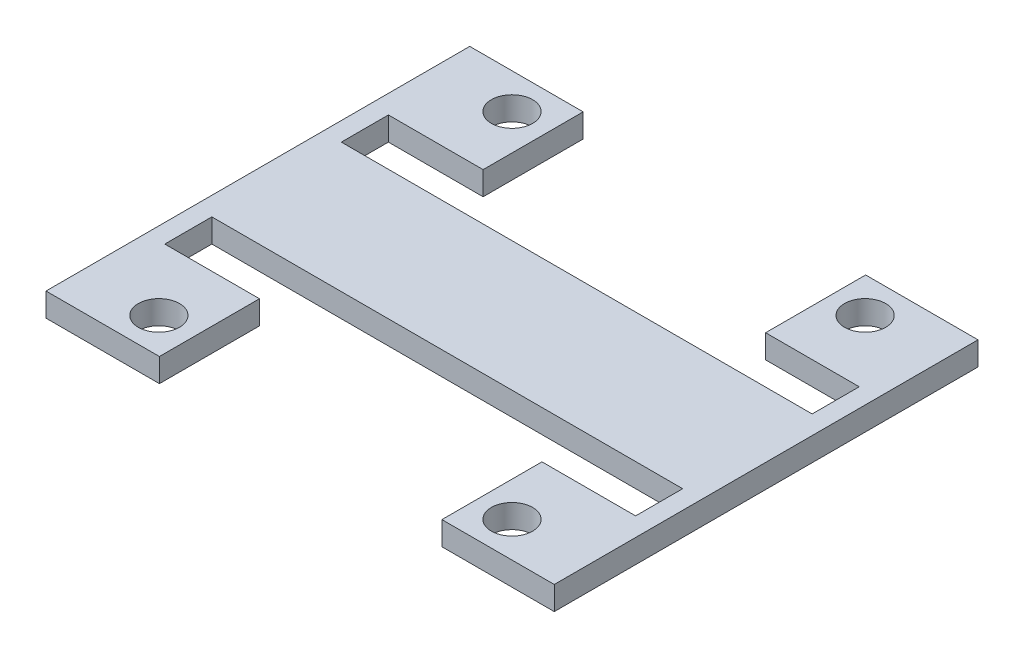
ISO-10303-21;
HEADER;
FILE_DESCRIPTION(('STEP AP214'),'2;1');
FILE_NAME('part.step','',(''),(''),'','','');
FILE_SCHEMA(('AUTOMOTIVE_DESIGN { 1 0 10303 214 1 1 1 1 }'));
ENDSEC;
DATA;
#1=APPLICATION_CONTEXT('core data for automotive mechanical design processes');
#2=APPLICATION_PROTOCOL_DEFINITION('international standard','automotive_design',2000,#1);
#3=PRODUCT_CONTEXT('',#1,'mechanical');
#4=PRODUCT('Part','Part','',(#3));
#5=PRODUCT_RELATED_PRODUCT_CATEGORY('part','',(#4));
#6=PRODUCT_DEFINITION_FORMATION('','',#4);
#7=PRODUCT_DEFINITION_CONTEXT('part definition',#1,'design');
#8=PRODUCT_DEFINITION('design','',#6,#7);
#9=PRODUCT_DEFINITION_SHAPE('','',#8);
#10=(LENGTH_UNIT() NAMED_UNIT(*) SI_UNIT(.MILLI.,.METRE.));
#11=(NAMED_UNIT(*) PLANE_ANGLE_UNIT() SI_UNIT($,.RADIAN.));
#12=(NAMED_UNIT(*) SI_UNIT($,.STERADIAN.) SOLID_ANGLE_UNIT());
#13=UNCERTAINTY_MEASURE_WITH_UNIT(LENGTH_MEASURE(1.E-05),#10,'distance_accuracy_value','');
#14=(GEOMETRIC_REPRESENTATION_CONTEXT(3) GLOBAL_UNCERTAINTY_ASSIGNED_CONTEXT((#13)) GLOBAL_UNIT_ASSIGNED_CONTEXT((#10,
#11,#12)) REPRESENTATION_CONTEXT('',''));
#15=CARTESIAN_POINT('',(0.,0.,0.));
#16=DIRECTION('',(0.,0.,1.));
#17=DIRECTION('',(1.,0.,0.));
#18=AXIS2_PLACEMENT_3D('',#15,#16,#17);
#19=CARTESIAN_POINT('',(0.,3.,0.));
#20=DIRECTION('',(0.,1.,0.));
#21=DIRECTION('',(0.,0.,1.));
#22=AXIS2_PLACEMENT_3D('',#19,#20,#21);
#23=PLANE('',#22);
#24=DIRECTION('',(0.,0.,-1.));
#25=VECTOR('',#24,1.);
#26=CARTESIAN_POINT('',(12.0458578100952,3.,0.));
#27=LINE('',#26,#25);
#28=CARTESIAN_POINT('',(12.0458578100952,3.,18.));
#29=VERTEX_POINT('',#28);
#30=CARTESIAN_POINT('',(12.0458578100952,3.,9.5));
#31=VERTEX_POINT('',#30);
#32=EDGE_CURVE('E362',#29,#31,#27,.T.);
#33=ORIENTED_EDGE('',*,*,#32,.F.);
#34=DIRECTION('',(1.,0.,0.));
#35=VECTOR('',#34,1.);
#36=CARTESIAN_POINT('',(0.,3.,18.));
#37=LINE('',#36,#35);
#38=CARTESIAN_POINT('',(21.59,3.,18.));
#39=VERTEX_POINT('',#38);
#40=EDGE_CURVE('E256',#29,#39,#37,.T.);
#41=ORIENTED_EDGE('',*,*,#40,.T.);
#42=DIRECTION('',(0.,0.,-1.));
#43=VECTOR('',#42,1.);
#44=CARTESIAN_POINT('',(21.59,3.,0.));
#45=LINE('',#44,#43);
#46=CARTESIAN_POINT('',(21.59,3.,-18.));
#47=VERTEX_POINT('',#46);
#48=EDGE_CURVE('E243',#39,#47,#45,.T.);
#49=ORIENTED_EDGE('',*,*,#48,.T.);
#50=DIRECTION('',(1.,0.,0.));
#51=VECTOR('',#50,1.);
#52=CARTESIAN_POINT('',(0.,3.,-18.));
#53=LINE('',#52,#51);
#54=CARTESIAN_POINT('',(12.0458578100952,3.,-18.));
#55=VERTEX_POINT('',#54);
#56=EDGE_CURVE('E246',#55,#47,#53,.T.);
#57=ORIENTED_EDGE('',*,*,#56,.F.);
#58=DIRECTION('',(0.,0.,-1.));
#59=VECTOR('',#58,1.);
#60=CARTESIAN_POINT('',(12.0458578100952,3.,0.));
#61=LINE('',#60,#59);
#62=CARTESIAN_POINT('',(12.0458578100952,3.,-9.5));
#63=VERTEX_POINT('',#62);
#64=EDGE_CURVE('E288',#63,#55,#61,.T.);
#65=ORIENTED_EDGE('',*,*,#64,.F.);
#66=DIRECTION('',(1.,0.,0.));
#67=VECTOR('',#66,1.);
#68=CARTESIAN_POINT('',(0.,3.,-9.5));
#69=LINE('',#68,#67);
#70=CARTESIAN_POINT('',(20.0002105911214,3.,-9.5));
#71=VERTEX_POINT('',#70);
#72=EDGE_CURVE('E196',#63,#71,#69,.T.);
#73=ORIENTED_EDGE('',*,*,#72,.T.);
#74=DIRECTION('',(0.,0.,-1.));
#75=VECTOR('',#74,1.);
#76=CARTESIAN_POINT('',(20.0002105911214,3.,0.));
#77=LINE('',#76,#75);
#78=CARTESIAN_POINT('',(20.0002105911214,3.,-5.5));
#79=VERTEX_POINT('',#78);
#80=EDGE_CURVE('E200',#79,#71,#77,.T.);
#81=ORIENTED_EDGE('',*,*,#80,.F.);
#82=DIRECTION('',(1.,0.,0.));
#83=VECTOR('',#82,1.);
#84=CARTESIAN_POINT('',(0.,3.,-5.5));
#85=LINE('',#84,#83);
#86=CARTESIAN_POINT('',(-19.9997894088786,3.,-5.5));
#87=VERTEX_POINT('',#86);
#88=EDGE_CURVE('E307',#87,#79,#85,.T.);
#89=ORIENTED_EDGE('',*,*,#88,.F.);
#90=DIRECTION('',(0.,0.,-1.));
#91=VECTOR('',#90,1.);
#92=CARTESIAN_POINT('',(-19.9997894088786,3.,0.));
#93=LINE('',#92,#91);
#94=CARTESIAN_POINT('',(-19.9997894088786,3.,-9.5));
#95=VERTEX_POINT('',#94);
#96=EDGE_CURVE('E195',#87,#95,#93,.T.);
#97=ORIENTED_EDGE('',*,*,#96,.T.);
#98=CARTESIAN_POINT('',(-11.9541421899048,3.,-9.5));
#99=VERTEX_POINT('',#98);
#100=EDGE_CURVE('E186',#95,#99,#69,.T.);
#101=ORIENTED_EDGE('',*,*,#100,.T.);
#102=DIRECTION('',(0.,0.,-1.));
#103=VECTOR('',#102,1.);
#104=CARTESIAN_POINT('',(-11.9541421899048,3.,0.));
#105=LINE('',#104,#103);
#106=CARTESIAN_POINT('',(-11.9541421899048,3.,-18.));
#107=VERTEX_POINT('',#106);
#108=EDGE_CURVE('E171',#99,#107,#105,.T.);
#109=ORIENTED_EDGE('',*,*,#108,.T.);
#110=DIRECTION('',(1.,0.,0.));
#111=VECTOR('',#110,1.);
#112=CARTESIAN_POINT('',(0.,3.,-18.));
#113=LINE('',#112,#111);
#114=CARTESIAN_POINT('',(-21.59,3.,-18.));
#115=VERTEX_POINT('',#114);
#116=EDGE_CURVE('E248',#115,#107,#113,.T.);
#117=ORIENTED_EDGE('',*,*,#116,.F.);
#118=DIRECTION('',(0.,0.,-1.));
#119=VECTOR('',#118,1.);
#120=CARTESIAN_POINT('',(-21.59,3.,0.));
#121=LINE('',#120,#119);
#122=CARTESIAN_POINT('',(-21.59,3.,18.));
#123=VERTEX_POINT('',#122);
#124=EDGE_CURVE('E250',#123,#115,#121,.T.);
#125=ORIENTED_EDGE('',*,*,#124,.F.);
#126=DIRECTION('',(1.,0.,0.));
#127=VECTOR('',#126,1.);
#128=CARTESIAN_POINT('',(0.,3.,18.));
#129=LINE('',#128,#127);
#130=CARTESIAN_POINT('',(-11.9541421899048,3.,18.));
#131=VERTEX_POINT('',#130);
#132=EDGE_CURVE('E253',#123,#131,#129,.T.);
#133=ORIENTED_EDGE('',*,*,#132,.T.);
#134=DIRECTION('',(0.,0.,-1.));
#135=VECTOR('',#134,1.);
#136=CARTESIAN_POINT('',(-11.9541421899048,3.,0.));
#137=LINE('',#136,#135);
#138=CARTESIAN_POINT('',(-11.9541421899048,3.,9.5));
#139=VERTEX_POINT('',#138);
#140=EDGE_CURVE('E59',#131,#139,#137,.T.);
#141=ORIENTED_EDGE('',*,*,#140,.T.);
#142=DIRECTION('',(1.,0.,0.));
#143=VECTOR('',#142,1.);
#144=CARTESIAN_POINT('',(0.,3.,9.5));
#145=LINE('',#144,#143);
#146=CARTESIAN_POINT('',(-19.9997894088786,3.,9.5));
#147=VERTEX_POINT('',#146);
#148=EDGE_CURVE('E328',#147,#139,#145,.T.);
#149=ORIENTED_EDGE('',*,*,#148,.F.);
#150=DIRECTION('',(0.,0.,1.));
#151=VECTOR('',#150,1.);
#152=CARTESIAN_POINT('',(-19.9997894088786,3.,0.));
#153=LINE('',#152,#151);
#154=CARTESIAN_POINT('',(-19.9997894088786,3.,5.5));
#155=VERTEX_POINT('',#154);
#156=EDGE_CURVE('E333',#155,#147,#153,.T.);
#157=ORIENTED_EDGE('',*,*,#156,.F.);
#158=DIRECTION('',(1.,0.,0.));
#159=VECTOR('',#158,1.);
#160=CARTESIAN_POINT('',(0.,3.,5.5));
#161=LINE('',#160,#159);
#162=CARTESIAN_POINT('',(20.0002105911214,3.,5.5));
#163=VERTEX_POINT('',#162);
#164=EDGE_CURVE('E336',#155,#163,#161,.T.);
#165=ORIENTED_EDGE('',*,*,#164,.T.);
#166=DIRECTION('',(0.,0.,1.));
#167=VECTOR('',#166,1.);
#168=CARTESIAN_POINT('',(20.0002105911214,3.,0.));
#169=LINE('',#168,#167);
#170=CARTESIAN_POINT('',(20.0002105911214,3.,9.5));
#171=VERTEX_POINT('',#170);
#172=EDGE_CURVE('E206',#163,#171,#169,.T.);
#173=ORIENTED_EDGE('',*,*,#172,.T.);
#174=EDGE_CURVE('E332',#31,#171,#145,.T.);
#175=ORIENTED_EDGE('',*,*,#174,.F.);
#176=EDGE_LOOP('',(#33,#41,#49,#57,#65,#73,#81,#89,#97,#101,#109,#117,#125,#133,#141,#149,#157,
#165,#173,#175));
#177=FACE_BOUND('',#176,.T.);
#178=CARTESIAN_POINT('',(15.,3.,-15.));
#179=DIRECTION('',(0.,1.,0.));
#180=DIRECTION('',(0.,0.,1.));
#181=AXIS2_PLACEMENT_3D('',#178,#179,#180);
#182=CIRCLE('',#181,1.75);
#183=CARTESIAN_POINT('',(15.,3.,-13.25));
#184=VERTEX_POINT('',#183);
#185=EDGE_CURVE('E267',#184,#184,#182,.T.);
#186=ORIENTED_EDGE('',*,*,#185,.F.);
#187=EDGE_LOOP('',(#186));
#188=FACE_BOUND('',#187,.T.);
#189=CARTESIAN_POINT('',(-15.,3.,-15.));
#190=DIRECTION('',(0.,1.,0.));
#191=DIRECTION('',(0.,0.,1.));
#192=AXIS2_PLACEMENT_3D('',#189,#190,#191);
#193=CIRCLE('',#192,1.75);
#194=CARTESIAN_POINT('',(-15.,3.,-13.25));
#195=VERTEX_POINT('',#194);
#196=EDGE_CURVE('E264',#195,#195,#193,.T.);
#197=ORIENTED_EDGE('',*,*,#196,.F.);
#198=EDGE_LOOP('',(#197));
#199=FACE_BOUND('',#198,.T.);
#200=CARTESIAN_POINT('',(15.,3.,15.));
#201=DIRECTION('',(0.,1.,0.));
#202=DIRECTION('',(0.,0.,1.));
#203=AXIS2_PLACEMENT_3D('',#200,#201,#202);
#204=CIRCLE('',#203,1.75);
#205=CARTESIAN_POINT('',(15.,3.,16.75));
#206=VERTEX_POINT('',#205);
#207=EDGE_CURVE('E261',#206,#206,#204,.T.);
#208=ORIENTED_EDGE('',*,*,#207,.F.);
#209=EDGE_LOOP('',(#208));
#210=FACE_BOUND('',#209,.T.);
#211=CARTESIAN_POINT('',(-15.,3.,15.));
#212=DIRECTION('',(0.,1.,0.));
#213=DIRECTION('',(0.,0.,1.));
#214=AXIS2_PLACEMENT_3D('',#211,#212,#213);
#215=CIRCLE('',#214,1.75);
#216=CARTESIAN_POINT('',(-15.,3.,16.75));
#217=VERTEX_POINT('',#216);
#218=EDGE_CURVE('E258',#217,#217,#215,.T.);
#219=ORIENTED_EDGE('',*,*,#218,.F.);
#220=EDGE_LOOP('',(#219));
#221=FACE_BOUND('',#220,.T.);
#222=ADVANCED_FACE('F37',(#177,#188,#199,#210,#221),#23,.T.);
#223=CARTESIAN_POINT('',(-21.59,1.,0.));
#224=DIRECTION('',(0.,1.,0.));
#225=DIRECTION('',(0.,0.,1.));
#226=AXIS2_PLACEMENT_3D('',#223,#224,#225);
#227=PLANE('',#226);
#228=CARTESIAN_POINT('',(15.,1.,-15.));
#229=DIRECTION('',(0.,1.,0.));
#230=DIRECTION('',(0.,0.,1.));
#231=AXIS2_PLACEMENT_3D('',#228,#229,#230);
#232=CIRCLE('',#231,1.75);
#233=CARTESIAN_POINT('',(15.,1.,-13.25));
#234=VERTEX_POINT('',#233);
#235=EDGE_CURVE('E227',#234,#234,#232,.T.);
#236=ORIENTED_EDGE('',*,*,#235,.T.);
#237=EDGE_LOOP('',(#236));
#238=FACE_BOUND('',#237,.T.);
#239=CARTESIAN_POINT('',(-15.,1.,15.));
#240=DIRECTION('',(0.,1.,0.));
#241=DIRECTION('',(0.,0.,1.));
#242=AXIS2_PLACEMENT_3D('',#239,#240,#241);
#243=CIRCLE('',#242,1.75);
#244=CARTESIAN_POINT('',(-15.,1.,16.75));
#245=VERTEX_POINT('',#244);
#246=EDGE_CURVE('E234',#245,#245,#243,.T.);
#247=ORIENTED_EDGE('',*,*,#246,.T.);
#248=EDGE_LOOP('',(#247));
#249=FACE_BOUND('',#248,.T.);
#250=CARTESIAN_POINT('',(15.,1.,15.));
#251=DIRECTION('',(0.,1.,0.));
#252=DIRECTION('',(0.,0.,1.));
#253=AXIS2_PLACEMENT_3D('',#250,#251,#252);
#254=CIRCLE('',#253,1.75);
#255=CARTESIAN_POINT('',(15.,1.,16.75));
#256=VERTEX_POINT('',#255);
#257=EDGE_CURVE('E237',#256,#256,#254,.T.);
#258=ORIENTED_EDGE('',*,*,#257,.T.);
#259=EDGE_LOOP('',(#258));
#260=FACE_BOUND('',#259,.T.);
#261=CARTESIAN_POINT('',(-15.,1.,-15.));
#262=DIRECTION('',(0.,1.,0.));
#263=DIRECTION('',(0.,0.,1.));
#264=AXIS2_PLACEMENT_3D('',#261,#262,#263);
#265=CIRCLE('',#264,1.75);
#266=CARTESIAN_POINT('',(-15.,1.,-13.25));
#267=VERTEX_POINT('',#266);
#268=EDGE_CURVE('E240',#267,#267,#265,.T.);
#269=ORIENTED_EDGE('',*,*,#268,.T.);
#270=EDGE_LOOP('',(#269));
#271=FACE_BOUND('',#270,.T.);
#272=DIRECTION('',(1.,0.,0.));
#273=VECTOR('',#272,1.);
#274=CARTESIAN_POINT('',(-21.59,1.,18.));
#275=LINE('',#274,#273);
#276=CARTESIAN_POINT('',(12.0458578100952,1.,18.));
#277=VERTEX_POINT('',#276);
#278=CARTESIAN_POINT('',(21.59,1.,18.));
#279=VERTEX_POINT('',#278);
#280=EDGE_CURVE('E228',#277,#279,#275,.T.);
#281=ORIENTED_EDGE('',*,*,#280,.F.);
#282=DIRECTION('',(0.,0.,-1.));
#283=VECTOR('',#282,1.);
#284=CARTESIAN_POINT('',(12.0458578100952,1.,0.));
#285=LINE('',#284,#283);
#286=CARTESIAN_POINT('',(12.0458578100952,1.,9.5));
#287=VERTEX_POINT('',#286);
#288=EDGE_CURVE('E353',#277,#287,#285,.T.);
#289=ORIENTED_EDGE('',*,*,#288,.T.);
#290=DIRECTION('',(1.,0.,0.));
#291=VECTOR('',#290,1.);
#292=CARTESIAN_POINT('',(0.,1.,9.5));
#293=LINE('',#292,#291);
#294=CARTESIAN_POINT('',(20.0002105911214,1.,9.5));
#295=VERTEX_POINT('',#294);
#296=EDGE_CURVE('E343',#287,#295,#293,.T.);
#297=ORIENTED_EDGE('',*,*,#296,.T.);
#298=DIRECTION('',(0.,0.,1.));
#299=VECTOR('',#298,1.);
#300=CARTESIAN_POINT('',(20.0002105911214,1.,0.));
#301=LINE('',#300,#299);
#302=CARTESIAN_POINT('',(20.0002105911214,1.,5.5));
#303=VERTEX_POINT('',#302);
#304=EDGE_CURVE('E331',#303,#295,#301,.T.);
#305=ORIENTED_EDGE('',*,*,#304,.F.);
#306=DIRECTION('',(1.,0.,0.));
#307=VECTOR('',#306,1.);
#308=CARTESIAN_POINT('',(0.,1.,5.5));
#309=LINE('',#308,#307);
#310=CARTESIAN_POINT('',(-19.9997894088786,1.,5.5));
#311=VERTEX_POINT('',#310);
#312=EDGE_CURVE('E347',#311,#303,#309,.T.);
#313=ORIENTED_EDGE('',*,*,#312,.F.);
#314=DIRECTION('',(0.,0.,1.));
#315=VECTOR('',#314,1.);
#316=CARTESIAN_POINT('',(-19.9997894088786,1.,0.));
#317=LINE('',#316,#315);
#318=CARTESIAN_POINT('',(-19.9997894088786,1.,9.5));
#319=VERTEX_POINT('',#318);
#320=EDGE_CURVE('E344',#311,#319,#317,.T.);
#321=ORIENTED_EDGE('',*,*,#320,.T.);
#322=CARTESIAN_POINT('',(-11.9541421899048,1.,9.5));
#323=VERTEX_POINT('',#322);
#324=EDGE_CURVE('E322',#319,#323,#293,.T.);
#325=ORIENTED_EDGE('',*,*,#324,.T.);
#326=DIRECTION('',(0.,0.,-1.));
#327=VECTOR('',#326,1.);
#328=CARTESIAN_POINT('',(-11.9541421899048,1.,0.));
#329=LINE('',#328,#327);
#330=CARTESIAN_POINT('',(-11.9541421899048,1.,18.));
#331=VERTEX_POINT('',#330);
#332=EDGE_CURVE('E309',#331,#323,#329,.T.);
#333=ORIENTED_EDGE('',*,*,#332,.F.);
#334=CARTESIAN_POINT('',(-21.59,1.,18.));
#335=VERTEX_POINT('',#334);
#336=EDGE_CURVE('E224',#335,#331,#275,.T.);
#337=ORIENTED_EDGE('',*,*,#336,.F.);
#338=DIRECTION('',(0.,0.,1.));
#339=VECTOR('',#338,1.);
#340=CARTESIAN_POINT('',(-21.59,1.,0.));
#341=LINE('',#340,#339);
#342=CARTESIAN_POINT('',(-21.59,1.,-18.));
#343=VERTEX_POINT('',#342);
#344=EDGE_CURVE('E216',#343,#335,#341,.T.);
#345=ORIENTED_EDGE('',*,*,#344,.F.);
#346=DIRECTION('',(1.,0.,0.));
#347=VECTOR('',#346,1.);
#348=CARTESIAN_POINT('',(-21.59,1.,-18.));
#349=LINE('',#348,#347);
#350=CARTESIAN_POINT('',(-11.9541421899048,1.,-18.));
#351=VERTEX_POINT('',#350);
#352=EDGE_CURVE('E229',#343,#351,#349,.T.);
#353=ORIENTED_EDGE('',*,*,#352,.T.);
#354=DIRECTION('',(0.,0.,-1.));
#355=VECTOR('',#354,1.);
#356=CARTESIAN_POINT('',(-11.9541421899048,1.,0.));
#357=LINE('',#356,#355);
#358=CARTESIAN_POINT('',(-11.9541421899048,1.,-9.5));
#359=VERTEX_POINT('',#358);
#360=EDGE_CURVE('E52',#359,#351,#357,.T.);
#361=ORIENTED_EDGE('',*,*,#360,.F.);
#362=DIRECTION('',(1.,0.,0.));
#363=VECTOR('',#362,1.);
#364=CARTESIAN_POINT('',(0.,1.,-9.5));
#365=LINE('',#364,#363);
#366=CARTESIAN_POINT('',(-19.9997894088786,1.,-9.5));
#367=VERTEX_POINT('',#366);
#368=EDGE_CURVE('E189',#367,#359,#365,.T.);
#369=ORIENTED_EDGE('',*,*,#368,.F.);
#370=DIRECTION('',(0.,0.,-1.));
#371=VECTOR('',#370,1.);
#372=CARTESIAN_POINT('',(-19.9997894088786,1.,0.));
#373=LINE('',#372,#371);
#374=CARTESIAN_POINT('',(-19.9997894088786,1.,-5.5));
#375=VERTEX_POINT('',#374);
#376=EDGE_CURVE('E215',#375,#367,#373,.T.);
#377=ORIENTED_EDGE('',*,*,#376,.F.);
#378=DIRECTION('',(1.,0.,0.));
#379=VECTOR('',#378,1.);
#380=CARTESIAN_POINT('',(0.,1.,-5.5));
#381=LINE('',#380,#379);
#382=CARTESIAN_POINT('',(20.0002105911214,1.,-5.5));
#383=VERTEX_POINT('',#382);
#384=EDGE_CURVE('E198',#375,#383,#381,.T.);
#385=ORIENTED_EDGE('',*,*,#384,.T.);
#386=DIRECTION('',(0.,0.,-1.));
#387=VECTOR('',#386,1.);
#388=CARTESIAN_POINT('',(20.0002105911214,1.,0.));
#389=LINE('',#388,#387);
#390=CARTESIAN_POINT('',(20.0002105911214,1.,-9.5));
#391=VERTEX_POINT('',#390);
#392=EDGE_CURVE('E314',#383,#391,#389,.T.);
#393=ORIENTED_EDGE('',*,*,#392,.T.);
#394=CARTESIAN_POINT('',(12.0458578100952,1.,-9.5));
#395=VERTEX_POINT('',#394);
#396=EDGE_CURVE('E302',#395,#391,#365,.T.);
#397=ORIENTED_EDGE('',*,*,#396,.F.);
#398=DIRECTION('',(0.,0.,-1.));
#399=VECTOR('',#398,1.);
#400=CARTESIAN_POINT('',(12.0458578100952,1.,0.));
#401=LINE('',#400,#399);
#402=CARTESIAN_POINT('',(12.0458578100952,1.,-18.));
#403=VERTEX_POINT('',#402);
#404=EDGE_CURVE('E291',#395,#403,#401,.T.);
#405=ORIENTED_EDGE('',*,*,#404,.T.);
#406=CARTESIAN_POINT('',(21.59,1.,-18.));
#407=VERTEX_POINT('',#406);
#408=EDGE_CURVE('E219',#403,#407,#349,.T.);
#409=ORIENTED_EDGE('',*,*,#408,.T.);
#410=DIRECTION('',(0.,0.,1.));
#411=VECTOR('',#410,1.);
#412=CARTESIAN_POINT('',(21.59,1.,0.));
#413=LINE('',#412,#411);
#414=EDGE_CURVE('E220',#407,#279,#413,.T.);
#415=ORIENTED_EDGE('',*,*,#414,.T.);
#416=EDGE_LOOP('',(#281,#289,#297,#305,#313,#321,#325,#333,#337,#345,#353,#361,#369,#377,#385,
#393,#397,#405,#409,#415));
#417=FACE_BOUND('',#416,.T.);
#418=ADVANCED_FACE('F369',(#238,#249,#260,#271,#417),#227,.F.);
#419=CARTESIAN_POINT('',(0.,1.,-9.5));
#420=DIRECTION('',(0.,0.,1.));
#421=DIRECTION('',(1.,0.,0.));
#422=AXIS2_PLACEMENT_3D('',#419,#420,#421);
#423=PLANE('',#422);
#424=ORIENTED_EDGE('',*,*,#368,.T.);
#425=DIRECTION('',(0.,1.,0.));
#426=VECTOR('',#425,1.);
#427=CARTESIAN_POINT('',(-11.9541421899048,-7.,-9.5));
#428=LINE('',#427,#426);
#429=EDGE_CURVE('E174',#359,#99,#428,.T.);
#430=ORIENTED_EDGE('',*,*,#429,.T.);
#431=ORIENTED_EDGE('',*,*,#100,.F.);
#432=DIRECTION('',(0.,1.,0.));
#433=VECTOR('',#432,1.);
#434=CARTESIAN_POINT('',(-19.9997894088786,1.,-9.5));
#435=LINE('',#434,#433);
#436=EDGE_CURVE('E207',#367,#95,#435,.T.);
#437=ORIENTED_EDGE('',*,*,#436,.F.);
#438=EDGE_LOOP('',(#424,#430,#431,#437));
#439=FACE_BOUND('',#438,.T.);
#440=ADVANCED_FACE('F184',(#439),#423,.T.);
#441=CARTESIAN_POINT('',(0.,1.,9.5));
#442=DIRECTION('',(0.,0.,1.));
#443=DIRECTION('',(1.,0.,0.));
#444=AXIS2_PLACEMENT_3D('',#441,#442,#443);
#445=PLANE('',#444);
#446=DIRECTION('',(0.,1.,0.));
#447=VECTOR('',#446,1.);
#448=CARTESIAN_POINT('',(-11.9541421899048,-7.,9.5));
#449=LINE('',#448,#447);
#450=EDGE_CURVE('E356',#323,#139,#449,.T.);
#451=ORIENTED_EDGE('',*,*,#450,.F.);
#452=ORIENTED_EDGE('',*,*,#324,.F.);
#453=DIRECTION('',(0.,1.,0.));
#454=VECTOR('',#453,1.);
#455=CARTESIAN_POINT('',(-19.9997894088786,1.,9.5));
#456=LINE('',#455,#454);
#457=EDGE_CURVE('E324',#319,#147,#456,.T.);
#458=ORIENTED_EDGE('',*,*,#457,.T.);
#459=ORIENTED_EDGE('',*,*,#148,.T.);
#460=EDGE_LOOP('',(#451,#452,#458,#459));
#461=FACE_BOUND('',#460,.T.);
#462=ADVANCED_FACE('F392',(#461),#445,.F.);
#463=CARTESIAN_POINT('',(0.,3.,-18.));
#464=DIRECTION('',(0.,0.,-1.));
#465=DIRECTION('',(-1.,0.,0.));
#466=AXIS2_PLACEMENT_3D('',#463,#464,#465);
#467=PLANE('',#466);
#468=ORIENTED_EDGE('',*,*,#116,.T.);
#469=DIRECTION('',(0.,-1.,0.));
#470=VECTOR('',#469,1.);
#471=CARTESIAN_POINT('',(-11.9541421899048,3.,-18.));
#472=LINE('',#471,#470);
#473=EDGE_CURVE('E11',#107,#351,#472,.T.);
#474=ORIENTED_EDGE('',*,*,#473,.T.);
#475=ORIENTED_EDGE('',*,*,#352,.F.);
#476=DIRECTION('',(0.,-1.,0.));
#477=VECTOR('',#476,1.);
#478=CARTESIAN_POINT('',(-21.59,3.,-18.));
#479=LINE('',#478,#477);
#480=EDGE_CURVE('E276',#115,#343,#479,.T.);
#481=ORIENTED_EDGE('',*,*,#480,.F.);
#482=EDGE_LOOP('',(#468,#474,#475,#481));
#483=FACE_BOUND('',#482,.T.);
#484=ADVANCED_FACE('F378',(#483),#467,.T.);
#485=CARTESIAN_POINT('',(0.,3.,18.));
#486=DIRECTION('',(0.,0.,-1.));
#487=DIRECTION('',(-1.,0.,0.));
#488=AXIS2_PLACEMENT_3D('',#485,#486,#487);
#489=PLANE('',#488);
#490=DIRECTION('',(0.,1.,0.));
#491=VECTOR('',#490,1.);
#492=CARTESIAN_POINT('',(-11.9541421899048,-7.,18.));
#493=LINE('',#492,#491);
#494=EDGE_CURVE('E357',#331,#131,#493,.T.);
#495=ORIENTED_EDGE('',*,*,#494,.T.);
#496=ORIENTED_EDGE('',*,*,#132,.F.);
#497=DIRECTION('',(0.,-1.,0.));
#498=VECTOR('',#497,1.);
#499=CARTESIAN_POINT('',(-21.59,3.,18.));
#500=LINE('',#499,#498);
#501=EDGE_CURVE('E273',#123,#335,#500,.T.);
#502=ORIENTED_EDGE('',*,*,#501,.T.);
#503=ORIENTED_EDGE('',*,*,#336,.T.);
#504=EDGE_LOOP('',(#495,#496,#502,#503));
#505=FACE_BOUND('',#504,.T.);
#506=ADVANCED_FACE('F385',(#505),#489,.F.);
#507=CARTESIAN_POINT('',(21.59,3.,0.));
#508=DIRECTION('',(-1.,0.,0.));
#509=DIRECTION('',(0.,0.,1.));
#510=AXIS2_PLACEMENT_3D('',#507,#508,#509);
#511=PLANE('',#510);
#512=DIRECTION('',(0.,-1.,0.));
#513=VECTOR('',#512,1.);
#514=CARTESIAN_POINT('',(21.59,3.,18.));
#515=LINE('',#514,#513);
#516=EDGE_CURVE('E270',#39,#279,#515,.T.);
#517=ORIENTED_EDGE('',*,*,#516,.T.);
#518=ORIENTED_EDGE('',*,*,#414,.F.);
#519=DIRECTION('',(0.,-1.,0.));
#520=VECTOR('',#519,1.);
#521=CARTESIAN_POINT('',(21.59,3.,-18.));
#522=LINE('',#521,#520);
#523=EDGE_CURVE('E279',#47,#407,#522,.T.);
#524=ORIENTED_EDGE('',*,*,#523,.F.);
#525=ORIENTED_EDGE('',*,*,#48,.F.);
#526=EDGE_LOOP('',(#517,#518,#524,#525));
#527=FACE_BOUND('',#526,.T.);
#528=ADVANCED_FACE('F39',(#527),#511,.F.);
#529=CARTESIAN_POINT('',(0.,3.,-18.));
#530=DIRECTION('',(0.,0.,-1.));
#531=DIRECTION('',(-1.,0.,0.));
#532=AXIS2_PLACEMENT_3D('',#529,#530,#531);
#533=PLANE('',#532);
#534=DIRECTION('',(0.,1.,0.));
#535=VECTOR('',#534,1.);
#536=CARTESIAN_POINT('',(12.0458578100952,-7.,-18.));
#537=LINE('',#536,#535);
#538=EDGE_CURVE('E179',#403,#55,#537,.T.);
#539=ORIENTED_EDGE('',*,*,#538,.T.);
#540=ORIENTED_EDGE('',*,*,#56,.T.);
#541=ORIENTED_EDGE('',*,*,#523,.T.);
#542=ORIENTED_EDGE('',*,*,#408,.F.);
#543=EDGE_LOOP('',(#539,#540,#541,#542));
#544=FACE_BOUND('',#543,.T.);
#545=ADVANCED_FACE('F366',(#544),#533,.T.);
#546=CARTESIAN_POINT('',(-21.59,3.,0.));
#547=DIRECTION('',(-1.,0.,0.));
#548=DIRECTION('',(0.,0.,1.));
#549=AXIS2_PLACEMENT_3D('',#546,#547,#548);
#550=PLANE('',#549);
#551=ORIENTED_EDGE('',*,*,#344,.T.);
#552=ORIENTED_EDGE('',*,*,#501,.F.);
#553=ORIENTED_EDGE('',*,*,#124,.T.);
#554=ORIENTED_EDGE('',*,*,#480,.T.);
#555=EDGE_LOOP('',(#551,#552,#553,#554));
#556=FACE_BOUND('',#555,.T.);
#557=ADVANCED_FACE('F380',(#556),#550,.T.);
#558=CARTESIAN_POINT('',(-15.,3.,-15.));
#559=DIRECTION('',(0.,-1.,0.));
#560=DIRECTION('',(0.,0.,-1.));
#561=AXIS2_PLACEMENT_3D('',#558,#559,#560);
#562=CYLINDRICAL_SURFACE('',#561,1.75);
#563=ORIENTED_EDGE('',*,*,#268,.F.);
#564=EDGE_LOOP('',(#563));
#565=FACE_BOUND('',#564,.T.);
#566=ORIENTED_EDGE('',*,*,#196,.T.);
#567=EDGE_LOOP('',(#566));
#568=FACE_BOUND('',#567,.T.);
#569=ADVANCED_FACE('F437',(#565,#568),#562,.F.);
#570=CARTESIAN_POINT('',(15.,3.,15.));
#571=DIRECTION('',(0.,-1.,0.));
#572=DIRECTION('',(0.,0.,-1.));
#573=AXIS2_PLACEMENT_3D('',#570,#571,#572);
#574=CYLINDRICAL_SURFACE('',#573,1.75);
#575=ORIENTED_EDGE('',*,*,#257,.F.);
#576=EDGE_LOOP('',(#575));
#577=FACE_BOUND('',#576,.T.);
#578=ORIENTED_EDGE('',*,*,#207,.T.);
#579=EDGE_LOOP('',(#578));
#580=FACE_BOUND('',#579,.T.);
#581=ADVANCED_FACE('F440',(#577,#580),#574,.F.);
#582=CARTESIAN_POINT('',(-15.,3.,15.));
#583=DIRECTION('',(0.,-1.,0.));
#584=DIRECTION('',(0.,0.,-1.));
#585=AXIS2_PLACEMENT_3D('',#582,#583,#584);
#586=CYLINDRICAL_SURFACE('',#585,1.75);
#587=ORIENTED_EDGE('',*,*,#246,.F.);
#588=EDGE_LOOP('',(#587));
#589=FACE_BOUND('',#588,.T.);
#590=ORIENTED_EDGE('',*,*,#218,.T.);
#591=EDGE_LOOP('',(#590));
#592=FACE_BOUND('',#591,.T.);
#593=ADVANCED_FACE('F444',(#589,#592),#586,.F.);
#594=CARTESIAN_POINT('',(0.,3.,18.));
#595=DIRECTION('',(0.,0.,-1.));
#596=DIRECTION('',(-1.,0.,0.));
#597=AXIS2_PLACEMENT_3D('',#594,#595,#596);
#598=PLANE('',#597);
#599=ORIENTED_EDGE('',*,*,#40,.F.);
#600=DIRECTION('',(0.,1.,0.));
#601=VECTOR('',#600,1.);
#602=CARTESIAN_POINT('',(12.0458578100952,-7.,18.));
#603=LINE('',#602,#601);
#604=EDGE_CURVE('E297',#277,#29,#603,.T.);
#605=ORIENTED_EDGE('',*,*,#604,.F.);
#606=ORIENTED_EDGE('',*,*,#280,.T.);
#607=ORIENTED_EDGE('',*,*,#516,.F.);
#608=EDGE_LOOP('',(#599,#605,#606,#607));
#609=FACE_BOUND('',#608,.T.);
#610=ADVANCED_FACE('F414',(#609),#598,.F.);
#611=CARTESIAN_POINT('',(15.,3.,-15.));
#612=DIRECTION('',(0.,-1.,0.));
#613=DIRECTION('',(0.,0.,-1.));
#614=AXIS2_PLACEMENT_3D('',#611,#612,#613);
#615=CYLINDRICAL_SURFACE('',#614,1.75);
#616=ORIENTED_EDGE('',*,*,#235,.F.);
#617=EDGE_LOOP('',(#616));
#618=FACE_BOUND('',#617,.T.);
#619=ORIENTED_EDGE('',*,*,#185,.T.);
#620=EDGE_LOOP('',(#619));
#621=FACE_BOUND('',#620,.T.);
#622=ADVANCED_FACE('F433',(#618,#621),#615,.F.);
#623=CARTESIAN_POINT('',(0.,1.,-5.5));
#624=DIRECTION('',(0.,0.,1.));
#625=DIRECTION('',(1.,0.,0.));
#626=AXIS2_PLACEMENT_3D('',#623,#624,#625);
#627=PLANE('',#626);
#628=ORIENTED_EDGE('',*,*,#88,.T.);
#629=DIRECTION('',(0.,1.,0.));
#630=VECTOR('',#629,1.);
#631=CARTESIAN_POINT('',(20.0002105911214,1.,-5.5));
#632=LINE('',#631,#630);
#633=EDGE_CURVE('E212',#383,#79,#632,.T.);
#634=ORIENTED_EDGE('',*,*,#633,.F.);
#635=ORIENTED_EDGE('',*,*,#384,.F.);
#636=DIRECTION('',(0.,1.,0.));
#637=VECTOR('',#636,1.);
#638=CARTESIAN_POINT('',(-19.9997894088786,1.,-5.5));
#639=LINE('',#638,#637);
#640=EDGE_CURVE('E204',#375,#87,#639,.T.);
#641=ORIENTED_EDGE('',*,*,#640,.T.);
#642=EDGE_LOOP('',(#628,#634,#635,#641));
#643=FACE_BOUND('',#642,.T.);
#644=ADVANCED_FACE('F373',(#643),#627,.F.);
#645=CARTESIAN_POINT('',(-19.9997894088786,1.,0.));
#646=DIRECTION('',(1.,0.,0.));
#647=DIRECTION('',(0.,0.,-1.));
#648=AXIS2_PLACEMENT_3D('',#645,#646,#647);
#649=PLANE('',#648);
#650=ORIENTED_EDGE('',*,*,#96,.F.);
#651=ORIENTED_EDGE('',*,*,#640,.F.);
#652=ORIENTED_EDGE('',*,*,#376,.T.);
#653=ORIENTED_EDGE('',*,*,#436,.T.);
#654=EDGE_LOOP('',(#650,#651,#652,#653));
#655=FACE_BOUND('',#654,.T.);
#656=ADVANCED_FACE('F375',(#655),#649,.T.);
#657=DIRECTION('',(0.,1.,0.));
#658=VECTOR('',#657,1.);
#659=CARTESIAN_POINT('',(12.0458578100952,1.,-9.5));
#660=LINE('',#659,#658);
#661=EDGE_CURVE('E45',#395,#63,#660,.T.);
#662=ORIENTED_EDGE('',*,*,#661,.F.);
#663=ORIENTED_EDGE('',*,*,#396,.T.);
#664=DIRECTION('',(0.,1.,0.));
#665=VECTOR('',#664,1.);
#666=CARTESIAN_POINT('',(20.0002105911214,1.,-9.5));
#667=LINE('',#666,#665);
#668=EDGE_CURVE('E209',#391,#71,#667,.T.);
#669=ORIENTED_EDGE('',*,*,#668,.T.);
#670=ORIENTED_EDGE('',*,*,#72,.F.);
#671=EDGE_LOOP('',(#662,#663,#669,#670));
#672=FACE_BOUND('',#671,.T.);
#673=ADVANCED_FACE('F299',(#672),#423,.T.);
#674=CARTESIAN_POINT('',(20.0002105911214,1.,0.));
#675=DIRECTION('',(1.,0.,0.));
#676=DIRECTION('',(0.,0.,-1.));
#677=AXIS2_PLACEMENT_3D('',#674,#675,#676);
#678=PLANE('',#677);
#679=ORIENTED_EDGE('',*,*,#80,.T.);
#680=ORIENTED_EDGE('',*,*,#668,.F.);
#681=ORIENTED_EDGE('',*,*,#392,.F.);
#682=ORIENTED_EDGE('',*,*,#633,.T.);
#683=EDGE_LOOP('',(#679,#680,#681,#682));
#684=FACE_BOUND('',#683,.T.);
#685=ADVANCED_FACE('F306',(#684),#678,.F.);
#686=CARTESIAN_POINT('',(20.0002105911214,1.,0.));
#687=DIRECTION('',(-1.,0.,0.));
#688=DIRECTION('',(0.,0.,1.));
#689=AXIS2_PLACEMENT_3D('',#686,#687,#688);
#690=PLANE('',#689);
#691=ORIENTED_EDGE('',*,*,#172,.F.);
#692=DIRECTION('',(0.,1.,0.));
#693=VECTOR('',#692,1.);
#694=CARTESIAN_POINT('',(20.0002105911214,1.,5.5));
#695=LINE('',#694,#693);
#696=EDGE_CURVE('E318',#303,#163,#695,.T.);
#697=ORIENTED_EDGE('',*,*,#696,.F.);
#698=ORIENTED_EDGE('',*,*,#304,.T.);
#699=DIRECTION('',(0.,1.,0.));
#700=VECTOR('',#699,1.);
#701=CARTESIAN_POINT('',(20.0002105911214,1.,9.5));
#702=LINE('',#701,#700);
#703=EDGE_CURVE('E223',#295,#171,#702,.T.);
#704=ORIENTED_EDGE('',*,*,#703,.T.);
#705=EDGE_LOOP('',(#691,#697,#698,#704));
#706=FACE_BOUND('',#705,.T.);
#707=ADVANCED_FACE('F403',(#706),#690,.T.);
#708=ORIENTED_EDGE('',*,*,#296,.F.);
#709=DIRECTION('',(0.,1.,0.));
#710=VECTOR('',#709,1.);
#711=CARTESIAN_POINT('',(12.0458578100952,1.,9.5));
#712=LINE('',#711,#710);
#713=EDGE_CURVE('E282',#287,#31,#712,.T.);
#714=ORIENTED_EDGE('',*,*,#713,.T.);
#715=ORIENTED_EDGE('',*,*,#174,.T.);
#716=ORIENTED_EDGE('',*,*,#703,.F.);
#717=EDGE_LOOP('',(#708,#714,#715,#716));
#718=FACE_BOUND('',#717,.T.);
#719=ADVANCED_FACE('F407',(#718),#445,.F.);
#720=CARTESIAN_POINT('',(-19.9997894088786,1.,0.));
#721=DIRECTION('',(-1.,0.,0.));
#722=DIRECTION('',(0.,0.,1.));
#723=AXIS2_PLACEMENT_3D('',#720,#721,#722);
#724=PLANE('',#723);
#725=ORIENTED_EDGE('',*,*,#156,.T.);
#726=ORIENTED_EDGE('',*,*,#457,.F.);
#727=ORIENTED_EDGE('',*,*,#320,.F.);
#728=DIRECTION('',(0.,1.,0.));
#729=VECTOR('',#728,1.);
#730=CARTESIAN_POINT('',(-19.9997894088786,1.,5.5));
#731=LINE('',#730,#729);
#732=EDGE_CURVE('E321',#311,#155,#731,.T.);
#733=ORIENTED_EDGE('',*,*,#732,.T.);
#734=EDGE_LOOP('',(#725,#726,#727,#733));
#735=FACE_BOUND('',#734,.T.);
#736=ADVANCED_FACE('F396',(#735),#724,.F.);
#737=CARTESIAN_POINT('',(0.,1.,5.5));
#738=DIRECTION('',(0.,0.,1.));
#739=DIRECTION('',(1.,0.,0.));
#740=AXIS2_PLACEMENT_3D('',#737,#738,#739);
#741=PLANE('',#740);
#742=ORIENTED_EDGE('',*,*,#164,.F.);
#743=ORIENTED_EDGE('',*,*,#732,.F.);
#744=ORIENTED_EDGE('',*,*,#312,.T.);
#745=ORIENTED_EDGE('',*,*,#696,.T.);
#746=EDGE_LOOP('',(#742,#743,#744,#745));
#747=FACE_BOUND('',#746,.T.);
#748=ADVANCED_FACE('F399',(#747),#741,.T.);
#749=CARTESIAN_POINT('',(12.0458578100952,-7.,0.));
#750=DIRECTION('',(1.,0.,0.));
#751=DIRECTION('',(0.,0.,-1.));
#752=AXIS2_PLACEMENT_3D('',#749,#750,#751);
#753=PLANE('',#752);
#754=ORIENTED_EDGE('',*,*,#604,.T.);
#755=ORIENTED_EDGE('',*,*,#32,.T.);
#756=ORIENTED_EDGE('',*,*,#713,.F.);
#757=ORIENTED_EDGE('',*,*,#288,.F.);
#758=EDGE_LOOP('',(#754,#755,#756,#757));
#759=FACE_BOUND('',#758,.T.);
#760=ADVANCED_FACE('F515',(#759),#753,.F.);
#761=CARTESIAN_POINT('',(12.0458578100952,-7.,0.));
#762=DIRECTION('',(1.,0.,0.));
#763=DIRECTION('',(0.,0.,-1.));
#764=AXIS2_PLACEMENT_3D('',#761,#762,#763);
#765=PLANE('',#764);
#766=ORIENTED_EDGE('',*,*,#661,.T.);
#767=ORIENTED_EDGE('',*,*,#64,.T.);
#768=ORIENTED_EDGE('',*,*,#538,.F.);
#769=ORIENTED_EDGE('',*,*,#404,.F.);
#770=EDGE_LOOP('',(#766,#767,#768,#769));
#771=FACE_BOUND('',#770,.T.);
#772=ADVANCED_FACE('F287',(#771),#765,.F.);
#773=CARTESIAN_POINT('',(-11.9541421899048,-7.,0.));
#774=DIRECTION('',(1.,0.,0.));
#775=DIRECTION('',(0.,0.,-1.));
#776=AXIS2_PLACEMENT_3D('',#773,#774,#775);
#777=PLANE('',#776);
#778=ORIENTED_EDGE('',*,*,#332,.T.);
#779=ORIENTED_EDGE('',*,*,#450,.T.);
#780=ORIENTED_EDGE('',*,*,#140,.F.);
#781=ORIENTED_EDGE('',*,*,#494,.F.);
#782=EDGE_LOOP('',(#778,#779,#780,#781));
#783=FACE_BOUND('',#782,.T.);
#784=ADVANCED_FACE('F387',(#783),#777,.T.);
#785=CARTESIAN_POINT('',(-11.9541421899048,-7.,0.));
#786=DIRECTION('',(1.,0.,0.));
#787=DIRECTION('',(0.,0.,-1.));
#788=AXIS2_PLACEMENT_3D('',#785,#786,#787);
#789=PLANE('',#788);
#790=ORIENTED_EDGE('',*,*,#360,.T.);
#791=ORIENTED_EDGE('',*,*,#473,.F.);
#792=ORIENTED_EDGE('',*,*,#108,.F.);
#793=ORIENTED_EDGE('',*,*,#429,.F.);
#794=EDGE_LOOP('',(#790,#791,#792,#793));
#795=FACE_BOUND('',#794,.T.);
#796=ADVANCED_FACE('F173',(#795),#789,.T.);
#797=CLOSED_SHELL('',(#222,#418,#440,#462,#484,#506,#528,#545,#557,#569,#581,#593,#610,#622,
#644,#656,#673,#685,#707,#719,#736,#748,#760,#772,#784,#796));
#798=MANIFOLD_SOLID_BREP('B2',#797);
#799=ADVANCED_BREP_SHAPE_REPRESENTATION('',(#18,#798),#14);
#800=SHAPE_DEFINITION_REPRESENTATION(#9,#799);
ENDSEC;
END-ISO-10303-21;
